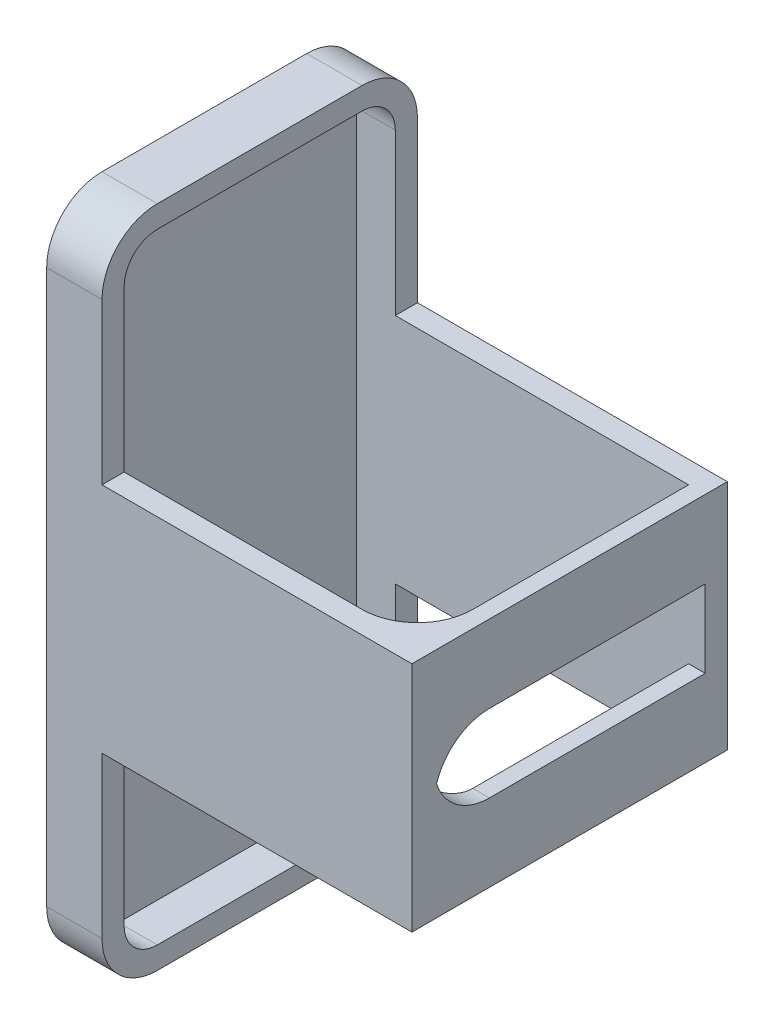
ISO-10303-21;
HEADER;
FILE_DESCRIPTION(('STEP AP214'),'2;1');
FILE_NAME('part.step','',(''),(''),'','','');
FILE_SCHEMA(('AUTOMOTIVE_DESIGN { 1 0 10303 214 1 1 1 1 }'));
ENDSEC;
DATA;
#1=APPLICATION_CONTEXT('core data for automotive mechanical design processes');
#2=APPLICATION_PROTOCOL_DEFINITION('international standard','automotive_design',2000,#1);
#3=PRODUCT_CONTEXT('',#1,'mechanical');
#4=PRODUCT('Part','Part','',(#3));
#5=PRODUCT_RELATED_PRODUCT_CATEGORY('part','',(#4));
#6=PRODUCT_DEFINITION_FORMATION('','',#4);
#7=PRODUCT_DEFINITION_CONTEXT('part definition',#1,'design');
#8=PRODUCT_DEFINITION('design','',#6,#7);
#9=PRODUCT_DEFINITION_SHAPE('','',#8);
#10=(LENGTH_UNIT() NAMED_UNIT(*) SI_UNIT(.MILLI.,.METRE.));
#11=(NAMED_UNIT(*) PLANE_ANGLE_UNIT() SI_UNIT($,.RADIAN.));
#12=(NAMED_UNIT(*) SI_UNIT($,.STERADIAN.) SOLID_ANGLE_UNIT());
#13=UNCERTAINTY_MEASURE_WITH_UNIT(LENGTH_MEASURE(1.E-05),#10,'distance_accuracy_value','');
#14=(GEOMETRIC_REPRESENTATION_CONTEXT(3) GLOBAL_UNCERTAINTY_ASSIGNED_CONTEXT((#13)) GLOBAL_UNIT_ASSIGNED_CONTEXT((#10,
#11,#12)) REPRESENTATION_CONTEXT('',''));
#15=CARTESIAN_POINT('',(0.,0.,0.));
#16=DIRECTION('',(0.,0.,1.));
#17=DIRECTION('',(1.,0.,0.));
#18=AXIS2_PLACEMENT_3D('',#15,#16,#17);
#19=CARTESIAN_POINT('',(157.5,-50.,-24.5));
#20=DIRECTION('',(0.,0.,1.));
#21=DIRECTION('',(0.,-1.,0.));
#22=AXIS2_PLACEMENT_3D('',#19,#20,#21);
#23=PLANE('',#22);
#24=DIRECTION('',(0.,1.,0.));
#25=VECTOR('',#24,1.);
#26=CARTESIAN_POINT('',(-94.5,-50.,-24.5));
#27=LINE('',#26,#25);
#28=CARTESIAN_POINT('',(-94.5,-21.,-24.5));
#29=VERTEX_POINT('',#28);
#30=CARTESIAN_POINT('',(-94.5,-6.99999999999999,-24.5));
#31=VERTEX_POINT('',#30);
#32=EDGE_CURVE('E472',#29,#31,#27,.T.);
#33=ORIENTED_EDGE('',*,*,#32,.T.);
#34=DIRECTION('',(1.,0.,0.));
#35=VECTOR('',#34,1.);
#36=CARTESIAN_POINT('',(157.5,-6.99999999999996,-24.5));
#37=LINE('',#36,#35);
#38=CARTESIAN_POINT('',(-91.5,-6.99999999999999,-24.5));
#39=VERTEX_POINT('',#38);
#40=EDGE_CURVE('E469',#31,#39,#37,.T.);
#41=ORIENTED_EDGE('',*,*,#40,.T.);
#42=DIRECTION('',(0.,1.,0.));
#43=VECTOR('',#42,1.);
#44=CARTESIAN_POINT('',(-91.5,0.,-24.5));
#45=LINE('',#44,#43);
#46=CARTESIAN_POINT('',(-91.5,7.00000000000001,-24.5));
#47=VERTEX_POINT('',#46);
#48=EDGE_CURVE('E466',#39,#47,#45,.T.);
#49=ORIENTED_EDGE('',*,*,#48,.T.);
#50=DIRECTION('',(1.,0.,0.));
#51=VECTOR('',#50,1.);
#52=CARTESIAN_POINT('',(157.5,7.00000000000004,-24.5));
#53=LINE('',#52,#51);
#54=CARTESIAN_POINT('',(-94.5,7.00000000000001,-24.5));
#55=VERTEX_POINT('',#54);
#56=EDGE_CURVE('E475',#55,#47,#53,.T.);
#57=ORIENTED_EDGE('',*,*,#56,.F.);
#58=DIRECTION('',(0.,1.,0.));
#59=VECTOR('',#58,1.);
#60=CARTESIAN_POINT('',(-94.5,-50.,-24.5));
#61=LINE('',#60,#59);
#62=CARTESIAN_POINT('',(-94.5,21.,-24.5));
#63=VERTEX_POINT('',#62);
#64=EDGE_CURVE('E478',#55,#63,#61,.T.);
#65=ORIENTED_EDGE('',*,*,#64,.T.);
#66=DIRECTION('',(1.,0.,0.));
#67=VECTOR('',#66,1.);
#68=CARTESIAN_POINT('',(157.5,21.,-24.5));
#69=LINE('',#68,#67);
#70=CARTESIAN_POINT('',(-147.5,21.,-24.5));
#71=VERTEX_POINT('',#70);
#72=EDGE_CURVE('E395',#71,#63,#69,.T.);
#73=ORIENTED_EDGE('',*,*,#72,.F.);
#74=DIRECTION('',(0.,1.,0.));
#75=VECTOR('',#74,1.);
#76=CARTESIAN_POINT('',(-147.5,-50.,-24.5));
#77=LINE('',#76,#75);
#78=CARTESIAN_POINT('',(-147.5,50.,-24.5));
#79=VERTEX_POINT('',#78);
#80=EDGE_CURVE('E381',#71,#79,#77,.T.);
#81=ORIENTED_EDGE('',*,*,#80,.T.);
#82=DIRECTION('',(-1.,0.,0.));
#83=VECTOR('',#82,1.);
#84=CARTESIAN_POINT('',(157.5,50.,-24.5));
#85=LINE('',#84,#83);
#86=CARTESIAN_POINT('',(-154.5,50.,-24.5));
#87=VERTEX_POINT('',#86);
#88=EDGE_CURVE('E360',#79,#87,#85,.T.);
#89=ORIENTED_EDGE('',*,*,#88,.T.);
#90=DIRECTION('',(0.,-1.,0.));
#91=VECTOR('',#90,1.);
#92=CARTESIAN_POINT('',(-154.5,-50.,-24.5));
#93=LINE('',#92,#91);
#94=CARTESIAN_POINT('',(-154.5,-50.,-24.5));
#95=VERTEX_POINT('',#94);
#96=EDGE_CURVE('E434',#87,#95,#93,.T.);
#97=ORIENTED_EDGE('',*,*,#96,.T.);
#98=DIRECTION('',(-1.,0.,0.));
#99=VECTOR('',#98,1.);
#100=CARTESIAN_POINT('',(157.5,-50.,-24.5));
#101=LINE('',#100,#99);
#102=CARTESIAN_POINT('',(-147.5,-50.,-24.5));
#103=VERTEX_POINT('',#102);
#104=EDGE_CURVE('E357',#103,#95,#101,.T.);
#105=ORIENTED_EDGE('',*,*,#104,.F.);
#106=DIRECTION('',(0.,-1.,0.));
#107=VECTOR('',#106,1.);
#108=CARTESIAN_POINT('',(-147.5,-50.,-24.5));
#109=LINE('',#108,#107);
#110=CARTESIAN_POINT('',(-147.5,-21.,-24.5));
#111=VERTEX_POINT('',#110);
#112=EDGE_CURVE('E407',#111,#103,#109,.T.);
#113=ORIENTED_EDGE('',*,*,#112,.F.);
#114=DIRECTION('',(-1.,0.,0.));
#115=VECTOR('',#114,1.);
#116=CARTESIAN_POINT('',(157.5,-21.,-24.5));
#117=LINE('',#116,#115);
#118=EDGE_CURVE('E417',#29,#111,#117,.T.);
#119=ORIENTED_EDGE('',*,*,#118,.F.);
#120=EDGE_LOOP('',(#33,#41,#49,#57,#65,#73,#81,#89,#97,#105,#113,#119));
#121=FACE_BOUND('',#120,.T.);
#122=ADVANCED_FACE('F43',(#121),#23,.T.);
#123=CARTESIAN_POINT('',(157.5,-50.,24.5));
#124=DIRECTION('',(0.,0.,-1.));
#125=DIRECTION('',(0.,1.,0.));
#126=AXIS2_PLACEMENT_3D('',#123,#124,#125);
#127=PLANE('',#126);
#128=DIRECTION('',(-1.,0.,0.));
#129=VECTOR('',#128,1.);
#130=CARTESIAN_POINT('',(157.5,21.,24.5));
#131=LINE('',#130,#129);
#132=CARTESIAN_POINT('',(-104.5,21.,24.5));
#133=VERTEX_POINT('',#132);
#134=CARTESIAN_POINT('',(-147.5,21.,24.5));
#135=VERTEX_POINT('',#134);
#136=EDGE_CURVE('E304',#133,#135,#131,.T.);
#137=ORIENTED_EDGE('',*,*,#136,.F.);
#138=DIRECTION('',(0.,1.,0.));
#139=VECTOR('',#138,1.);
#140=CARTESIAN_POINT('',(-104.5,-50.,24.5));
#141=LINE('',#140,#139);
#142=CARTESIAN_POINT('',(-104.5,3.,24.5));
#143=VERTEX_POINT('',#142);
#144=EDGE_CURVE('E283',#133,#143,#141,.F.);
#145=ORIENTED_EDGE('',*,*,#144,.T.);
#146=DIRECTION('',(0.,1.,0.));
#147=VECTOR('',#146,1.);
#148=CARTESIAN_POINT('',(-104.5,-50.,24.5));
#149=LINE('',#148,#147);
#150=CARTESIAN_POINT('',(-104.5,-2.99999999999999,24.5));
#151=VERTEX_POINT('',#150);
#152=EDGE_CURVE('E285',#143,#151,#149,.F.);
#153=ORIENTED_EDGE('',*,*,#152,.T.);
#154=DIRECTION('',(0.,1.,0.));
#155=VECTOR('',#154,1.);
#156=CARTESIAN_POINT('',(-104.5,-50.,24.5));
#157=LINE('',#156,#155);
#158=CARTESIAN_POINT('',(-104.5,-21.,24.5));
#159=VERTEX_POINT('',#158);
#160=EDGE_CURVE('E267',#151,#159,#157,.F.);
#161=ORIENTED_EDGE('',*,*,#160,.T.);
#162=DIRECTION('',(1.,0.,0.));
#163=VECTOR('',#162,1.);
#164=CARTESIAN_POINT('',(157.5,-21.,24.5));
#165=LINE('',#164,#163);
#166=CARTESIAN_POINT('',(-147.5,-21.,24.5));
#167=VERTEX_POINT('',#166);
#168=EDGE_CURVE('E308',#167,#159,#165,.T.);
#169=ORIENTED_EDGE('',*,*,#168,.F.);
#170=DIRECTION('',(0.,1.,0.));
#171=VECTOR('',#170,1.);
#172=CARTESIAN_POINT('',(-147.5,-50.,24.5));
#173=LINE('',#172,#171);
#174=CARTESIAN_POINT('',(-147.5,-50.,24.5));
#175=VERTEX_POINT('',#174);
#176=EDGE_CURVE('E306',#175,#167,#173,.T.);
#177=ORIENTED_EDGE('',*,*,#176,.F.);
#178=DIRECTION('',(-1.,0.,0.));
#179=VECTOR('',#178,1.);
#180=CARTESIAN_POINT('',(157.5,-50.,24.5));
#181=LINE('',#180,#179);
#182=CARTESIAN_POINT('',(-154.5,-50.,24.5));
#183=VERTEX_POINT('',#182);
#184=EDGE_CURVE('E372',#175,#183,#181,.T.);
#185=ORIENTED_EDGE('',*,*,#184,.T.);
#186=DIRECTION('',(0.,1.,0.));
#187=VECTOR('',#186,1.);
#188=CARTESIAN_POINT('',(-154.5,-50.,24.5));
#189=LINE('',#188,#187);
#190=CARTESIAN_POINT('',(-154.5,50.,24.5));
#191=VERTEX_POINT('',#190);
#192=EDGE_CURVE('E457',#183,#191,#189,.T.);
#193=ORIENTED_EDGE('',*,*,#192,.T.);
#194=DIRECTION('',(-1.,0.,0.));
#195=VECTOR('',#194,1.);
#196=CARTESIAN_POINT('',(157.5,50.,24.5));
#197=LINE('',#196,#195);
#198=CARTESIAN_POINT('',(-147.5,50.,24.5));
#199=VERTEX_POINT('',#198);
#200=EDGE_CURVE('E369',#199,#191,#197,.T.);
#201=ORIENTED_EDGE('',*,*,#200,.F.);
#202=DIRECTION('',(0.,-1.,0.));
#203=VECTOR('',#202,1.);
#204=CARTESIAN_POINT('',(-147.5,-50.,24.5));
#205=LINE('',#204,#203);
#206=EDGE_CURVE('E301',#199,#135,#205,.T.);
#207=ORIENTED_EDGE('',*,*,#206,.T.);
#208=EDGE_LOOP('',(#137,#145,#153,#161,#169,#177,#185,#193,#201,#207));
#209=FACE_BOUND('',#208,.T.);
#210=ADVANCED_FACE('F552',(#209),#127,.T.);
#211=CARTESIAN_POINT('',(-91.5,58.5,-15.));
#212=DIRECTION('',(-1.,0.,0.));
#213=DIRECTION('',(0.,-1.,0.));
#214=AXIS2_PLACEMENT_3D('',#211,#212,#213);
#215=PLANE('',#214);
#216=ORIENTED_EDGE('',*,*,#48,.F.);
#217=DIRECTION('',(0.,0.,-1.));
#218=VECTOR('',#217,1.);
#219=CARTESIAN_POINT('',(-91.5,-6.99999999999999,0.));
#220=LINE('',#219,#218);
#221=CARTESIAN_POINT('',(-91.5,-7.,14.5));
#222=VERTEX_POINT('',#221);
#223=EDGE_CURVE('E242',#222,#39,#220,.T.);
#224=ORIENTED_EDGE('',*,*,#223,.F.);
#225=CARTESIAN_POINT('',(-91.5,3.,14.5));
#226=DIRECTION('',(-1.,0.,0.));
#227=DIRECTION('',(0.,-1.,0.));
#228=AXIS2_PLACEMENT_3D('',#225,#226,#227);
#229=CIRCLE('',#228,10.);
#230=CARTESIAN_POINT('',(-91.5,0.,24.0393920141695));
#231=VERTEX_POINT('',#230);
#232=EDGE_CURVE('E61',#222,#231,#229,.T.);
#233=ORIENTED_EDGE('',*,*,#232,.T.);
#234=CARTESIAN_POINT('',(-91.5,-2.99999999999999,14.5));
#235=DIRECTION('',(-1.,0.,0.));
#236=DIRECTION('',(0.,-1.,0.));
#237=AXIS2_PLACEMENT_3D('',#234,#235,#236);
#238=CIRCLE('',#237,10.);
#239=CARTESIAN_POINT('',(-91.5,7.00000000000001,14.5));
#240=VERTEX_POINT('',#239);
#241=EDGE_CURVE('E271',#231,#240,#238,.T.);
#242=ORIENTED_EDGE('',*,*,#241,.T.);
#243=DIRECTION('',(0.,0.,-1.));
#244=VECTOR('',#243,1.);
#245=CARTESIAN_POINT('',(-91.5,7.00000000000001,0.));
#246=LINE('',#245,#244);
#247=EDGE_CURVE('E258',#240,#47,#246,.T.);
#248=ORIENTED_EDGE('',*,*,#247,.T.);
#249=EDGE_LOOP('',(#216,#224,#233,#242,#248));
#250=FACE_BOUND('',#249,.T.);
#251=DIRECTION('',(0.,1.,0.));
#252=VECTOR('',#251,1.);
#253=CARTESIAN_POINT('',(-91.5,-50.,28.5));
#254=LINE('',#253,#252);
#255=CARTESIAN_POINT('',(-91.5,-21.,28.5));
#256=VERTEX_POINT('',#255);
#257=CARTESIAN_POINT('',(-91.5,21.,28.5));
#258=VERTEX_POINT('',#257);
#259=EDGE_CURVE('E293',#256,#258,#254,.T.);
#260=ORIENTED_EDGE('',*,*,#259,.F.);
#261=DIRECTION('',(0.,0.,1.));
#262=VECTOR('',#261,1.);
#263=CARTESIAN_POINT('',(-91.5,-21.,-28.500012));
#264=LINE('',#263,#262);
#265=CARTESIAN_POINT('',(-91.5,-21.,-28.5));
#266=VERTEX_POINT('',#265);
#267=EDGE_CURVE('E440',#266,#256,#264,.T.);
#268=ORIENTED_EDGE('',*,*,#267,.F.);
#269=DIRECTION('',(0.,-1.,0.));
#270=VECTOR('',#269,1.);
#271=CARTESIAN_POINT('',(-91.5,-50.,-28.5));
#272=LINE('',#271,#270);
#273=CARTESIAN_POINT('',(-91.5,21.,-28.5));
#274=VERTEX_POINT('',#273);
#275=EDGE_CURVE('E296',#274,#266,#272,.T.);
#276=ORIENTED_EDGE('',*,*,#275,.F.);
#277=DIRECTION('',(0.,0.,1.));
#278=VECTOR('',#277,1.);
#279=CARTESIAN_POINT('',(-91.5,21.,-28.500012));
#280=LINE('',#279,#278);
#281=EDGE_CURVE('E292',#274,#258,#280,.T.);
#282=ORIENTED_EDGE('',*,*,#281,.T.);
#283=EDGE_LOOP('',(#260,#268,#276,#282));
#284=FACE_BOUND('',#283,.T.);
#285=ADVANCED_FACE('F601',(#250,#284),#215,.F.);
#286=CARTESIAN_POINT('',(157.5,-60.,-18.5));
#287=DIRECTION('',(0.,1.,0.));
#288=DIRECTION('',(0.,0.,1.));
#289=AXIS2_PLACEMENT_3D('',#286,#287,#288);
#290=PLANE('',#289);
#291=DIRECTION('',(0.,0.,-1.));
#292=VECTOR('',#291,1.);
#293=CARTESIAN_POINT('',(-157.5,-60.,-18.5));
#294=LINE('',#293,#292);
#295=CARTESIAN_POINT('',(-157.5,-60.,18.5));
#296=VERTEX_POINT('',#295);
#297=CARTESIAN_POINT('',(-157.5,-60.,-18.5));
#298=VERTEX_POINT('',#297);
#299=EDGE_CURVE('E327',#296,#298,#294,.T.);
#300=ORIENTED_EDGE('',*,*,#299,.T.);
#301=DIRECTION('',(-1.,0.,0.));
#302=VECTOR('',#301,1.);
#303=CARTESIAN_POINT('',(157.5,-60.,-18.5));
#304=LINE('',#303,#302);
#305=CARTESIAN_POINT('',(-147.5,-60.,-18.5));
#306=VERTEX_POINT('',#305);
#307=EDGE_CURVE('E325',#306,#298,#304,.T.);
#308=ORIENTED_EDGE('',*,*,#307,.F.);
#309=DIRECTION('',(0.,0.,1.));
#310=VECTOR('',#309,1.);
#311=CARTESIAN_POINT('',(-147.5,-60.,-28.500012));
#312=LINE('',#311,#310);
#313=CARTESIAN_POINT('',(-147.5,-60.,18.4999999999999));
#314=VERTEX_POINT('',#313);
#315=EDGE_CURVE('E419',#306,#314,#312,.T.);
#316=ORIENTED_EDGE('',*,*,#315,.T.);
#317=DIRECTION('',(-1.,0.,0.));
#318=VECTOR('',#317,1.);
#319=CARTESIAN_POINT('',(157.5,-60.,18.5));
#320=LINE('',#319,#318);
#321=EDGE_CURVE('E323',#314,#296,#320,.T.);
#322=ORIENTED_EDGE('',*,*,#321,.T.);
#323=EDGE_LOOP('',(#300,#308,#316,#322));
#324=FACE_BOUND('',#323,.T.);
#325=ADVANCED_FACE('F594',(#324),#290,.F.);
#326=CARTESIAN_POINT('',(157.5,-56.,-18.5));
#327=DIRECTION('',(0.,1.,0.));
#328=DIRECTION('',(0.,0.,1.));
#329=AXIS2_PLACEMENT_3D('',#326,#327,#328);
#330=PLANE('',#329);
#331=DIRECTION('',(-1.,0.,0.));
#332=VECTOR('',#331,1.);
#333=CARTESIAN_POINT('',(157.5,-56.,-18.5));
#334=LINE('',#333,#332);
#335=CARTESIAN_POINT('',(-147.5,-56.,-18.5));
#336=VERTEX_POINT('',#335);
#337=CARTESIAN_POINT('',(-154.5,-56.,-18.5));
#338=VERTEX_POINT('',#337);
#339=EDGE_CURVE('E354',#336,#338,#334,.T.);
#340=ORIENTED_EDGE('',*,*,#339,.T.);
#341=DIRECTION('',(0.,0.,1.));
#342=VECTOR('',#341,1.);
#343=CARTESIAN_POINT('',(-154.5,-56.,-18.5));
#344=LINE('',#343,#342);
#345=CARTESIAN_POINT('',(-154.5,-56.,18.5));
#346=VERTEX_POINT('',#345);
#347=EDGE_CURVE('E463',#338,#346,#344,.T.);
#348=ORIENTED_EDGE('',*,*,#347,.T.);
#349=DIRECTION('',(-1.,0.,0.));
#350=VECTOR('',#349,1.);
#351=CARTESIAN_POINT('',(157.5,-56.,18.5));
#352=LINE('',#351,#350);
#353=CARTESIAN_POINT('',(-147.5,-56.,18.5));
#354=VERTEX_POINT('',#353);
#355=EDGE_CURVE('E351',#354,#346,#352,.T.);
#356=ORIENTED_EDGE('',*,*,#355,.F.);
#357=DIRECTION('',(0.,0.,1.));
#358=VECTOR('',#357,1.);
#359=CARTESIAN_POINT('',(-147.5,-56.,-18.5));
#360=LINE('',#359,#358);
#361=EDGE_CURVE('E411',#336,#354,#360,.T.);
#362=ORIENTED_EDGE('',*,*,#361,.F.);
#363=EDGE_LOOP('',(#340,#348,#356,#362));
#364=FACE_BOUND('',#363,.T.);
#365=ADVANCED_FACE('F575',(#364),#330,.T.);
#366=CARTESIAN_POINT('',(157.5,56.,-18.5));
#367=DIRECTION('',(0.,-1.,0.));
#368=DIRECTION('',(0.,0.,-1.));
#369=AXIS2_PLACEMENT_3D('',#366,#367,#368);
#370=PLANE('',#369);
#371=DIRECTION('',(-1.,0.,0.));
#372=VECTOR('',#371,1.);
#373=CARTESIAN_POINT('',(157.5,56.,18.5));
#374=LINE('',#373,#372);
#375=CARTESIAN_POINT('',(-147.5,56.,18.5));
#376=VERTEX_POINT('',#375);
#377=CARTESIAN_POINT('',(-154.5,56.,18.5));
#378=VERTEX_POINT('',#377);
#379=EDGE_CURVE('E366',#376,#378,#374,.T.);
#380=ORIENTED_EDGE('',*,*,#379,.T.);
#381=DIRECTION('',(0.,0.,-1.));
#382=VECTOR('',#381,1.);
#383=CARTESIAN_POINT('',(-154.5,56.,-18.5));
#384=LINE('',#383,#382);
#385=CARTESIAN_POINT('',(-154.5,56.,-18.5));
#386=VERTEX_POINT('',#385);
#387=EDGE_CURVE('E451',#378,#386,#384,.T.);
#388=ORIENTED_EDGE('',*,*,#387,.T.);
#389=DIRECTION('',(-1.,0.,0.));
#390=VECTOR('',#389,1.);
#391=CARTESIAN_POINT('',(157.5,56.,-18.5));
#392=LINE('',#391,#390);
#393=CARTESIAN_POINT('',(-147.5,56.,-18.5));
#394=VERTEX_POINT('',#393);
#395=EDGE_CURVE('E363',#394,#386,#392,.T.);
#396=ORIENTED_EDGE('',*,*,#395,.F.);
#397=DIRECTION('',(0.,0.,1.));
#398=VECTOR('',#397,1.);
#399=CARTESIAN_POINT('',(-147.5,56.,-18.5));
#400=LINE('',#399,#398);
#401=EDGE_CURVE('E387',#394,#376,#400,.T.);
#402=ORIENTED_EDGE('',*,*,#401,.T.);
#403=EDGE_LOOP('',(#380,#388,#396,#402));
#404=FACE_BOUND('',#403,.T.);
#405=ADVANCED_FACE('F559',(#404),#370,.T.);
#406=CARTESIAN_POINT('',(157.5,60.,-18.5));
#407=DIRECTION('',(0.,-1.,0.));
#408=DIRECTION('',(0.,0.,-1.));
#409=AXIS2_PLACEMENT_3D('',#406,#407,#408);
#410=PLANE('',#409);
#411=DIRECTION('',(0.,0.,1.));
#412=VECTOR('',#411,1.);
#413=CARTESIAN_POINT('',(-157.5,60.,-18.5));
#414=LINE('',#413,#412);
#415=CARTESIAN_POINT('',(-157.5,60.,-18.5));
#416=VERTEX_POINT('',#415);
#417=CARTESIAN_POINT('',(-157.5,60.,18.5));
#418=VERTEX_POINT('',#417);
#419=EDGE_CURVE('E339',#416,#418,#414,.T.);
#420=ORIENTED_EDGE('',*,*,#419,.T.);
#421=DIRECTION('',(-1.,0.,0.));
#422=VECTOR('',#421,1.);
#423=CARTESIAN_POINT('',(157.5,60.,18.5));
#424=LINE('',#423,#422);
#425=CARTESIAN_POINT('',(-147.5,60.,18.5));
#426=VERTEX_POINT('',#425);
#427=EDGE_CURVE('E317',#426,#418,#424,.T.);
#428=ORIENTED_EDGE('',*,*,#427,.F.);
#429=DIRECTION('',(0.,0.,1.));
#430=VECTOR('',#429,1.);
#431=CARTESIAN_POINT('',(-147.5,60.,-28.500012));
#432=LINE('',#431,#430);
#433=CARTESIAN_POINT('',(-147.5,60.,-18.5));
#434=VERTEX_POINT('',#433);
#435=EDGE_CURVE('E420',#434,#426,#432,.T.);
#436=ORIENTED_EDGE('',*,*,#435,.F.);
#437=DIRECTION('',(-1.,0.,0.));
#438=VECTOR('',#437,1.);
#439=CARTESIAN_POINT('',(157.5,60.,-18.5));
#440=LINE('',#439,#438);
#441=EDGE_CURVE('E315',#434,#416,#440,.T.);
#442=ORIENTED_EDGE('',*,*,#441,.T.);
#443=EDGE_LOOP('',(#420,#428,#436,#442));
#444=FACE_BOUND('',#443,.T.);
#445=ADVANCED_FACE('F537',(#444),#410,.F.);
#446=CARTESIAN_POINT('',(157.5,-50.,18.5));
#447=DIRECTION('',(-1.,0.,0.));
#448=DIRECTION('',(0.,0.,1.));
#449=AXIS2_PLACEMENT_3D('',#446,#447,#448);
#450=CYLINDRICAL_SURFACE('',#449,10.);
#451=CARTESIAN_POINT('',(-157.5,-50.,18.5));
#452=DIRECTION('',(1.,0.,0.));
#453=DIRECTION('',(0.,0.,1.));
#454=AXIS2_PLACEMENT_3D('',#451,#452,#453);
#455=CIRCLE('',#454,10.);
#456=CARTESIAN_POINT('',(-157.5,-50.,28.5));
#457=VERTEX_POINT('',#456);
#458=EDGE_CURVE('E330',#457,#296,#455,.T.);
#459=ORIENTED_EDGE('',*,*,#458,.T.);
#460=ORIENTED_EDGE('',*,*,#321,.F.);
#461=CARTESIAN_POINT('',(-147.5,-50.,18.5));
#462=DIRECTION('',(-1.,0.,0.));
#463=DIRECTION('',(0.,0.,1.));
#464=AXIS2_PLACEMENT_3D('',#461,#462,#463);
#465=CIRCLE('',#464,10.);
#466=CARTESIAN_POINT('',(-147.5,-50.,28.5));
#467=VERTEX_POINT('',#466);
#468=EDGE_CURVE('E404',#314,#467,#465,.T.);
#469=ORIENTED_EDGE('',*,*,#468,.T.);
#470=DIRECTION('',(-1.,0.,0.));
#471=VECTOR('',#470,1.);
#472=CARTESIAN_POINT('',(157.5,-50.,28.5));
#473=LINE('',#472,#471);
#474=EDGE_CURVE('E321',#467,#457,#473,.T.);
#475=ORIENTED_EDGE('',*,*,#474,.T.);
#476=EDGE_LOOP('',(#459,#460,#469,#475));
#477=FACE_BOUND('',#476,.T.);
#478=ADVANCED_FACE('F586',(#477),#450,.T.);
#479=CARTESIAN_POINT('',(157.5,50.,18.5));
#480=DIRECTION('',(-1.,0.,0.));
#481=DIRECTION('',(0.,0.,1.));
#482=AXIS2_PLACEMENT_3D('',#479,#480,#481);
#483=CYLINDRICAL_SURFACE('',#482,10.);
#484=CARTESIAN_POINT('',(-157.5,50.,18.5));
#485=DIRECTION('',(1.,0.,0.));
#486=DIRECTION('',(0.,0.,1.));
#487=AXIS2_PLACEMENT_3D('',#484,#485,#486);
#488=CIRCLE('',#487,10.);
#489=CARTESIAN_POINT('',(-157.5,50.,28.5));
#490=VERTEX_POINT('',#489);
#491=EDGE_CURVE('E336',#418,#490,#488,.T.);
#492=ORIENTED_EDGE('',*,*,#491,.T.);
#493=DIRECTION('',(-1.,0.,0.));
#494=VECTOR('',#493,1.);
#495=CARTESIAN_POINT('',(157.5,50.,28.5));
#496=LINE('',#495,#494);
#497=CARTESIAN_POINT('',(-147.5,50.,28.5));
#498=VERTEX_POINT('',#497);
#499=EDGE_CURVE('E319',#498,#490,#496,.T.);
#500=ORIENTED_EDGE('',*,*,#499,.F.);
#501=CARTESIAN_POINT('',(-147.5,50.,18.5));
#502=DIRECTION('',(1.,0.,0.));
#503=DIRECTION('',(0.,0.,-1.));
#504=AXIS2_PLACEMENT_3D('',#501,#502,#503);
#505=CIRCLE('',#504,10.);
#506=EDGE_CURVE('E379',#426,#498,#505,.T.);
#507=ORIENTED_EDGE('',*,*,#506,.F.);
#508=ORIENTED_EDGE('',*,*,#427,.T.);
#509=EDGE_LOOP('',(#492,#500,#507,#508));
#510=FACE_BOUND('',#509,.T.);
#511=ADVANCED_FACE('F540',(#510),#483,.T.);
#512=CARTESIAN_POINT('',(157.5,50.,-18.5));
#513=DIRECTION('',(-1.,0.,0.));
#514=DIRECTION('',(0.,0.,1.));
#515=AXIS2_PLACEMENT_3D('',#512,#513,#514);
#516=CYLINDRICAL_SURFACE('',#515,10.);
#517=CARTESIAN_POINT('',(-157.5,50.,-18.5));
#518=DIRECTION('',(1.,0.,0.));
#519=DIRECTION('',(0.,0.,-1.));
#520=AXIS2_PLACEMENT_3D('',#517,#518,#519);
#521=CIRCLE('',#520,10.);
#522=CARTESIAN_POINT('',(-157.5,50.,-28.5));
#523=VERTEX_POINT('',#522);
#524=EDGE_CURVE('E342',#523,#416,#521,.T.);
#525=ORIENTED_EDGE('',*,*,#524,.T.);
#526=ORIENTED_EDGE('',*,*,#441,.F.);
#527=CARTESIAN_POINT('',(-147.5,50.,-18.5));
#528=DIRECTION('',(1.,0.,0.));
#529=DIRECTION('',(0.,0.,-1.));
#530=AXIS2_PLACEMENT_3D('',#527,#528,#529);
#531=CIRCLE('',#530,10.);
#532=CARTESIAN_POINT('',(-147.5,50.,-28.5));
#533=VERTEX_POINT('',#532);
#534=EDGE_CURVE('E377',#533,#434,#531,.T.);
#535=ORIENTED_EDGE('',*,*,#534,.F.);
#536=DIRECTION('',(-1.,0.,0.));
#537=VECTOR('',#536,1.);
#538=CARTESIAN_POINT('',(157.5,50.,-28.5));
#539=LINE('',#538,#537);
#540=EDGE_CURVE('E313',#533,#523,#539,.T.);
#541=ORIENTED_EDGE('',*,*,#540,.T.);
#542=EDGE_LOOP('',(#525,#526,#535,#541));
#543=FACE_BOUND('',#542,.T.);
#544=ADVANCED_FACE('F530',(#543),#516,.T.);
#545=CARTESIAN_POINT('',(-157.5,-50.,-18.5));
#546=DIRECTION('',(-1.,0.,0.));
#547=DIRECTION('',(0.,0.,1.));
#548=AXIS2_PLACEMENT_3D('',#545,#546,#547);
#549=PLANE('',#548);
#550=CARTESIAN_POINT('',(-157.5,-50.,-18.5));
#551=DIRECTION('',(1.,0.,0.));
#552=DIRECTION('',(0.,0.,1.));
#553=AXIS2_PLACEMENT_3D('',#550,#551,#552);
#554=CIRCLE('',#553,10.);
#555=CARTESIAN_POINT('',(-157.5,-50.,-28.5));
#556=VERTEX_POINT('',#555);
#557=EDGE_CURVE('E348',#298,#556,#554,.T.);
#558=ORIENTED_EDGE('',*,*,#557,.F.);
#559=ORIENTED_EDGE('',*,*,#299,.F.);
#560=ORIENTED_EDGE('',*,*,#458,.F.);
#561=DIRECTION('',(0.,-1.,0.));
#562=VECTOR('',#561,1.);
#563=CARTESIAN_POINT('',(-157.5,-50.,28.5));
#564=LINE('',#563,#562);
#565=EDGE_CURVE('E333',#490,#457,#564,.T.);
#566=ORIENTED_EDGE('',*,*,#565,.F.);
#567=ORIENTED_EDGE('',*,*,#491,.F.);
#568=ORIENTED_EDGE('',*,*,#419,.F.);
#569=ORIENTED_EDGE('',*,*,#524,.F.);
#570=DIRECTION('',(0.,1.,0.));
#571=VECTOR('',#570,1.);
#572=CARTESIAN_POINT('',(-157.5,-50.,-28.5));
#573=LINE('',#572,#571);
#574=EDGE_CURVE('E345',#556,#523,#573,.T.);
#575=ORIENTED_EDGE('',*,*,#574,.F.);
#576=EDGE_LOOP('',(#558,#559,#560,#566,#567,#568,#569,#575));
#577=FACE_BOUND('',#576,.T.);
#578=ADVANCED_FACE('F591',(#577),#549,.T.);
#579=CARTESIAN_POINT('',(157.5,-50.,-18.5));
#580=DIRECTION('',(-1.,0.,0.));
#581=DIRECTION('',(0.,0.,1.));
#582=AXIS2_PLACEMENT_3D('',#579,#580,#581);
#583=CYLINDRICAL_SURFACE('',#582,10.);
#584=ORIENTED_EDGE('',*,*,#557,.T.);
#585=DIRECTION('',(-1.,0.,0.));
#586=VECTOR('',#585,1.);
#587=CARTESIAN_POINT('',(157.5,-50.,-28.5));
#588=LINE('',#587,#586);
#589=CARTESIAN_POINT('',(-147.5,-50.,-28.5));
#590=VERTEX_POINT('',#589);
#591=EDGE_CURVE('E311',#590,#556,#588,.T.);
#592=ORIENTED_EDGE('',*,*,#591,.F.);
#593=CARTESIAN_POINT('',(-147.5,-50.,-18.5));
#594=DIRECTION('',(-1.,0.,0.));
#595=DIRECTION('',(0.,0.,1.));
#596=AXIS2_PLACEMENT_3D('',#593,#594,#595);
#597=CIRCLE('',#596,10.);
#598=EDGE_CURVE('E398',#590,#306,#597,.T.);
#599=ORIENTED_EDGE('',*,*,#598,.T.);
#600=ORIENTED_EDGE('',*,*,#307,.T.);
#601=EDGE_LOOP('',(#584,#592,#599,#600));
#602=FACE_BOUND('',#601,.T.);
#603=ADVANCED_FACE('F597',(#602),#583,.T.);
#604=CARTESIAN_POINT('',(157.5,-21.,-28.500012));
#605=DIRECTION('',(0.,1.,0.));
#606=DIRECTION('',(-1.,0.,0.));
#607=AXIS2_PLACEMENT_3D('',#604,#605,#606);
#608=PLANE('',#607);
#609=ORIENTED_EDGE('',*,*,#267,.T.);
#610=DIRECTION('',(-1.,0.,0.));
#611=VECTOR('',#610,1.);
#612=CARTESIAN_POINT('',(157.5,-21.,28.5));
#613=LINE('',#612,#611);
#614=CARTESIAN_POINT('',(-147.5,-21.,28.5));
#615=VERTEX_POINT('',#614);
#616=EDGE_CURVE('E442',#256,#615,#613,.T.);
#617=ORIENTED_EDGE('',*,*,#616,.T.);
#618=DIRECTION('',(0.,0.,1.));
#619=VECTOR('',#618,1.);
#620=CARTESIAN_POINT('',(-147.5,-21.,-28.500012));
#621=LINE('',#620,#619);
#622=EDGE_CURVE('E438',#167,#615,#621,.T.);
#623=ORIENTED_EDGE('',*,*,#622,.F.);
#624=ORIENTED_EDGE('',*,*,#168,.T.);
#625=CARTESIAN_POINT('',(-104.5,-21.,14.5));
#626=DIRECTION('',(0.,1.,0.));
#627=DIRECTION('',(-1.,0.,0.));
#628=AXIS2_PLACEMENT_3D('',#625,#626,#627);
#629=CIRCLE('',#628,10.);
#630=CARTESIAN_POINT('',(-94.5,-21.,14.5));
#631=VERTEX_POINT('',#630);
#632=EDGE_CURVE('E12',#159,#631,#629,.T.);
#633=ORIENTED_EDGE('',*,*,#632,.T.);
#634=DIRECTION('',(0.,0.,-1.));
#635=VECTOR('',#634,1.);
#636=CARTESIAN_POINT('',(-94.5,-21.,0.));
#637=LINE('',#636,#635);
#638=EDGE_CURVE('E488',#631,#29,#637,.T.);
#639=ORIENTED_EDGE('',*,*,#638,.T.);
#640=ORIENTED_EDGE('',*,*,#118,.T.);
#641=CARTESIAN_POINT('',(-147.5,-21.,-28.5));
#642=VERTEX_POINT('',#641);
#643=EDGE_CURVE('E437',#642,#111,#621,.T.);
#644=ORIENTED_EDGE('',*,*,#643,.F.);
#645=DIRECTION('',(-1.,0.,0.));
#646=VECTOR('',#645,1.);
#647=CARTESIAN_POINT('',(157.5,-21.,-28.5));
#648=LINE('',#647,#646);
#649=EDGE_CURVE('E415',#266,#642,#648,.T.);
#650=ORIENTED_EDGE('',*,*,#649,.F.);
#651=EDGE_LOOP('',(#609,#617,#623,#624,#633,#639,#640,#644,#650));
#652=FACE_BOUND('',#651,.T.);
#653=ADVANCED_FACE('F493',(#652),#608,.F.);
#654=CARTESIAN_POINT('',(157.5,-50.,-18.5));
#655=DIRECTION('',(-1.,0.,0.));
#656=DIRECTION('',(0.,0.,1.));
#657=AXIS2_PLACEMENT_3D('',#654,#655,#656);
#658=CYLINDRICAL_SURFACE('',#657,6.);
#659=ORIENTED_EDGE('',*,*,#104,.T.);
#660=CARTESIAN_POINT('',(-154.5,-50.,-18.5));
#661=DIRECTION('',(-1.,0.,0.));
#662=DIRECTION('',(0.,0.,1.));
#663=AXIS2_PLACEMENT_3D('',#660,#661,#662);
#664=CIRCLE('',#663,6.);
#665=EDGE_CURVE('E298',#95,#338,#664,.T.);
#666=ORIENTED_EDGE('',*,*,#665,.T.);
#667=ORIENTED_EDGE('',*,*,#339,.F.);
#668=CARTESIAN_POINT('',(-147.5,-50.,-18.5));
#669=DIRECTION('',(-1.,0.,0.));
#670=DIRECTION('',(0.,0.,1.));
#671=AXIS2_PLACEMENT_3D('',#668,#669,#670);
#672=CIRCLE('',#671,6.);
#673=EDGE_CURVE('E409',#103,#336,#672,.T.);
#674=ORIENTED_EDGE('',*,*,#673,.F.);
#675=EDGE_LOOP('',(#659,#666,#667,#674));
#676=FACE_BOUND('',#675,.T.);
#677=ADVANCED_FACE('F566',(#676),#658,.F.);
#678=CARTESIAN_POINT('',(157.5,50.,-18.5));
#679=DIRECTION('',(-1.,0.,0.));
#680=DIRECTION('',(0.,0.,1.));
#681=AXIS2_PLACEMENT_3D('',#678,#679,#680);
#682=CYLINDRICAL_SURFACE('',#681,6.);
#683=ORIENTED_EDGE('',*,*,#395,.T.);
#684=CARTESIAN_POINT('',(-154.5,50.,-18.5));
#685=DIRECTION('',(-1.,0.,0.));
#686=DIRECTION('',(0.,0.,1.));
#687=AXIS2_PLACEMENT_3D('',#684,#685,#686);
#688=CIRCLE('',#687,6.);
#689=EDGE_CURVE('E448',#386,#87,#688,.T.);
#690=ORIENTED_EDGE('',*,*,#689,.T.);
#691=ORIENTED_EDGE('',*,*,#88,.F.);
#692=CARTESIAN_POINT('',(-147.5,50.,-18.5));
#693=DIRECTION('',(1.,0.,0.));
#694=DIRECTION('',(0.,0.,-1.));
#695=AXIS2_PLACEMENT_3D('',#692,#693,#694);
#696=CIRCLE('',#695,6.);
#697=EDGE_CURVE('E384',#79,#394,#696,.T.);
#698=ORIENTED_EDGE('',*,*,#697,.T.);
#699=EDGE_LOOP('',(#683,#690,#691,#698));
#700=FACE_BOUND('',#699,.T.);
#701=ADVANCED_FACE('F561',(#700),#682,.F.);
#702=CARTESIAN_POINT('',(157.5,50.,18.5));
#703=DIRECTION('',(-1.,0.,0.));
#704=DIRECTION('',(0.,0.,1.));
#705=AXIS2_PLACEMENT_3D('',#702,#703,#704);
#706=CYLINDRICAL_SURFACE('',#705,6.00000000000001);
#707=ORIENTED_EDGE('',*,*,#200,.T.);
#708=CARTESIAN_POINT('',(-154.5,50.,18.5));
#709=DIRECTION('',(-1.,0.,0.));
#710=DIRECTION('',(0.,0.,1.));
#711=AXIS2_PLACEMENT_3D('',#708,#709,#710);
#712=CIRCLE('',#711,6.00000000000001);
#713=EDGE_CURVE('E454',#191,#378,#712,.T.);
#714=ORIENTED_EDGE('',*,*,#713,.T.);
#715=ORIENTED_EDGE('',*,*,#379,.F.);
#716=CARTESIAN_POINT('',(-147.5,50.,18.5));
#717=DIRECTION('',(1.,0.,0.));
#718=DIRECTION('',(0.,0.,-1.));
#719=AXIS2_PLACEMENT_3D('',#716,#717,#718);
#720=CIRCLE('',#719,6.00000000000001);
#721=EDGE_CURVE('E390',#376,#199,#720,.T.);
#722=ORIENTED_EDGE('',*,*,#721,.T.);
#723=EDGE_LOOP('',(#707,#714,#715,#722));
#724=FACE_BOUND('',#723,.T.);
#725=ADVANCED_FACE('F555',(#724),#706,.F.);
#726=CARTESIAN_POINT('',(-154.5,-50.,-18.5));
#727=DIRECTION('',(-1.,0.,0.));
#728=DIRECTION('',(0.,0.,1.));
#729=AXIS2_PLACEMENT_3D('',#726,#727,#728);
#730=PLANE('',#729);
#731=ORIENTED_EDGE('',*,*,#96,.F.);
#732=ORIENTED_EDGE('',*,*,#689,.F.);
#733=ORIENTED_EDGE('',*,*,#387,.F.);
#734=ORIENTED_EDGE('',*,*,#713,.F.);
#735=ORIENTED_EDGE('',*,*,#192,.F.);
#736=CARTESIAN_POINT('',(-154.5,-50.,18.5));
#737=DIRECTION('',(-1.,0.,0.));
#738=DIRECTION('',(0.,0.,1.));
#739=AXIS2_PLACEMENT_3D('',#736,#737,#738);
#740=CIRCLE('',#739,6.);
#741=EDGE_CURVE('E460',#346,#183,#740,.T.);
#742=ORIENTED_EDGE('',*,*,#741,.F.);
#743=ORIENTED_EDGE('',*,*,#347,.F.);
#744=ORIENTED_EDGE('',*,*,#665,.F.);
#745=EDGE_LOOP('',(#731,#732,#733,#734,#735,#742,#743,#744));
#746=FACE_BOUND('',#745,.T.);
#747=ADVANCED_FACE('F630',(#746),#730,.F.);
#748=CARTESIAN_POINT('',(157.5,-50.,18.5));
#749=DIRECTION('',(-1.,0.,0.));
#750=DIRECTION('',(0.,0.,1.));
#751=AXIS2_PLACEMENT_3D('',#748,#749,#750);
#752=CYLINDRICAL_SURFACE('',#751,6.);
#753=ORIENTED_EDGE('',*,*,#355,.T.);
#754=ORIENTED_EDGE('',*,*,#741,.T.);
#755=ORIENTED_EDGE('',*,*,#184,.F.);
#756=CARTESIAN_POINT('',(-147.5,-50.,18.5));
#757=DIRECTION('',(-1.,0.,0.));
#758=DIRECTION('',(0.,0.,1.));
#759=AXIS2_PLACEMENT_3D('',#756,#757,#758);
#760=CIRCLE('',#759,6.);
#761=EDGE_CURVE('E413',#354,#175,#760,.T.);
#762=ORIENTED_EDGE('',*,*,#761,.F.);
#763=EDGE_LOOP('',(#753,#754,#755,#762));
#764=FACE_BOUND('',#763,.T.);
#765=ADVANCED_FACE('F577',(#764),#752,.F.);
#766=CARTESIAN_POINT('',(-147.5,-50.,-28.500012));
#767=DIRECTION('',(-1.,0.,0.));
#768=DIRECTION('',(0.,0.,1.));
#769=AXIS2_PLACEMENT_3D('',#766,#767,#768);
#770=PLANE('',#769);
#771=DIRECTION('',(0.,-1.,0.));
#772=VECTOR('',#771,1.);
#773=CARTESIAN_POINT('',(-147.5,-50.,-28.5));
#774=LINE('',#773,#772);
#775=EDGE_CURVE('E401',#642,#590,#774,.T.);
#776=ORIENTED_EDGE('',*,*,#775,.F.);
#777=ORIENTED_EDGE('',*,*,#643,.T.);
#778=ORIENTED_EDGE('',*,*,#112,.T.);
#779=ORIENTED_EDGE('',*,*,#673,.T.);
#780=ORIENTED_EDGE('',*,*,#361,.T.);
#781=ORIENTED_EDGE('',*,*,#761,.T.);
#782=ORIENTED_EDGE('',*,*,#176,.T.);
#783=ORIENTED_EDGE('',*,*,#622,.T.);
#784=DIRECTION('',(0.,-1.,0.));
#785=VECTOR('',#784,1.);
#786=CARTESIAN_POINT('',(-147.5,-50.,28.5));
#787=LINE('',#786,#785);
#788=EDGE_CURVE('E422',#615,#467,#787,.T.);
#789=ORIENTED_EDGE('',*,*,#788,.T.);
#790=ORIENTED_EDGE('',*,*,#468,.F.);
#791=ORIENTED_EDGE('',*,*,#315,.F.);
#792=ORIENTED_EDGE('',*,*,#598,.F.);
#793=EDGE_LOOP('',(#776,#777,#778,#779,#780,#781,#782,#783,#789,#790,#791,#792));
#794=FACE_BOUND('',#793,.T.);
#795=ADVANCED_FACE('F571',(#794),#770,.F.);
#796=CARTESIAN_POINT('',(157.5,-50.,-28.5));
#797=DIRECTION('',(0.,0.,1.));
#798=DIRECTION('',(0.,-1.,0.));
#799=AXIS2_PLACEMENT_3D('',#796,#797,#798);
#800=PLANE('',#799);
#801=ORIENTED_EDGE('',*,*,#275,.T.);
#802=ORIENTED_EDGE('',*,*,#649,.T.);
#803=ORIENTED_EDGE('',*,*,#775,.T.);
#804=ORIENTED_EDGE('',*,*,#591,.T.);
#805=ORIENTED_EDGE('',*,*,#574,.T.);
#806=ORIENTED_EDGE('',*,*,#540,.F.);
#807=DIRECTION('',(0.,1.,0.));
#808=VECTOR('',#807,1.);
#809=CARTESIAN_POINT('',(-147.5,-50.,-28.5));
#810=LINE('',#809,#808);
#811=CARTESIAN_POINT('',(-147.5,21.,-28.5));
#812=VERTEX_POINT('',#811);
#813=EDGE_CURVE('E375',#812,#533,#810,.T.);
#814=ORIENTED_EDGE('',*,*,#813,.F.);
#815=DIRECTION('',(1.,0.,0.));
#816=VECTOR('',#815,1.);
#817=CARTESIAN_POINT('',(157.5,21.,-28.5));
#818=LINE('',#817,#816);
#819=EDGE_CURVE('E393',#812,#274,#818,.T.);
#820=ORIENTED_EDGE('',*,*,#819,.T.);
#821=EDGE_LOOP('',(#801,#802,#803,#804,#805,#806,#814,#820));
#822=FACE_BOUND('',#821,.T.);
#823=ADVANCED_FACE('F525',(#822),#800,.F.);
#824=CARTESIAN_POINT('',(157.5,-50.,28.5));
#825=DIRECTION('',(0.,0.,-1.));
#826=DIRECTION('',(0.,1.,0.));
#827=AXIS2_PLACEMENT_3D('',#824,#825,#826);
#828=PLANE('',#827);
#829=ORIENTED_EDGE('',*,*,#616,.F.);
#830=ORIENTED_EDGE('',*,*,#259,.T.);
#831=DIRECTION('',(1.,0.,0.));
#832=VECTOR('',#831,1.);
#833=CARTESIAN_POINT('',(157.5,21.,28.5));
#834=LINE('',#833,#832);
#835=CARTESIAN_POINT('',(-147.5,21.,28.5));
#836=VERTEX_POINT('',#835);
#837=EDGE_CURVE('E428',#836,#258,#834,.T.);
#838=ORIENTED_EDGE('',*,*,#837,.F.);
#839=DIRECTION('',(0.,1.,0.));
#840=VECTOR('',#839,1.);
#841=CARTESIAN_POINT('',(-147.5,-50.,28.5));
#842=LINE('',#841,#840);
#843=EDGE_CURVE('E431',#836,#498,#842,.T.);
#844=ORIENTED_EDGE('',*,*,#843,.T.);
#845=ORIENTED_EDGE('',*,*,#499,.T.);
#846=ORIENTED_EDGE('',*,*,#565,.T.);
#847=ORIENTED_EDGE('',*,*,#474,.F.);
#848=ORIENTED_EDGE('',*,*,#788,.F.);
#849=EDGE_LOOP('',(#829,#830,#838,#844,#845,#846,#847,#848));
#850=FACE_BOUND('',#849,.T.);
#851=ADVANCED_FACE('F547',(#850),#828,.F.);
#852=CARTESIAN_POINT('',(-147.5,-50.,-28.500012));
#853=DIRECTION('',(1.,0.,0.));
#854=DIRECTION('',(0.,0.,-1.));
#855=AXIS2_PLACEMENT_3D('',#852,#853,#854);
#856=PLANE('',#855);
#857=ORIENTED_EDGE('',*,*,#813,.T.);
#858=ORIENTED_EDGE('',*,*,#534,.T.);
#859=ORIENTED_EDGE('',*,*,#435,.T.);
#860=ORIENTED_EDGE('',*,*,#506,.T.);
#861=ORIENTED_EDGE('',*,*,#843,.F.);
#862=DIRECTION('',(0.,0.,1.));
#863=VECTOR('',#862,1.);
#864=CARTESIAN_POINT('',(-147.5,21.,-28.500012));
#865=LINE('',#864,#863);
#866=EDGE_CURVE('E425',#135,#836,#865,.T.);
#867=ORIENTED_EDGE('',*,*,#866,.F.);
#868=ORIENTED_EDGE('',*,*,#206,.F.);
#869=ORIENTED_EDGE('',*,*,#721,.F.);
#870=ORIENTED_EDGE('',*,*,#401,.F.);
#871=ORIENTED_EDGE('',*,*,#697,.F.);
#872=ORIENTED_EDGE('',*,*,#80,.F.);
#873=EDGE_CURVE('E423',#812,#71,#865,.T.);
#874=ORIENTED_EDGE('',*,*,#873,.F.);
#875=EDGE_LOOP('',(#857,#858,#859,#860,#861,#867,#868,#869,#870,#871,#872,#874));
#876=FACE_BOUND('',#875,.T.);
#877=ADVANCED_FACE('F521',(#876),#856,.T.);
#878=CARTESIAN_POINT('',(157.5,21.,-28.500012));
#879=DIRECTION('',(0.,-1.,0.));
#880=DIRECTION('',(0.,0.,-1.));
#881=AXIS2_PLACEMENT_3D('',#878,#879,#880);
#882=PLANE('',#881);
#883=ORIENTED_EDGE('',*,*,#281,.F.);
#884=ORIENTED_EDGE('',*,*,#819,.F.);
#885=ORIENTED_EDGE('',*,*,#873,.T.);
#886=ORIENTED_EDGE('',*,*,#72,.T.);
#887=DIRECTION('',(0.,0.,-1.));
#888=VECTOR('',#887,1.);
#889=CARTESIAN_POINT('',(-94.5,21.,0.));
#890=LINE('',#889,#888);
#891=CARTESIAN_POINT('',(-94.5,21.,14.5));
#892=VERTEX_POINT('',#891);
#893=EDGE_CURVE('E484',#892,#63,#890,.T.);
#894=ORIENTED_EDGE('',*,*,#893,.F.);
#895=CARTESIAN_POINT('',(-104.5,21.,14.5));
#896=DIRECTION('',(0.,-1.,0.));
#897=DIRECTION('',(0.,0.,-1.));
#898=AXIS2_PLACEMENT_3D('',#895,#896,#897);
#899=CIRCLE('',#898,10.);
#900=EDGE_CURVE('E53',#892,#133,#899,.T.);
#901=ORIENTED_EDGE('',*,*,#900,.T.);
#902=ORIENTED_EDGE('',*,*,#136,.T.);
#903=ORIENTED_EDGE('',*,*,#866,.T.);
#904=ORIENTED_EDGE('',*,*,#837,.T.);
#905=EDGE_LOOP('',(#883,#884,#885,#886,#894,#901,#902,#903,#904));
#906=FACE_BOUND('',#905,.T.);
#907=ADVANCED_FACE('F517',(#906),#882,.F.);
#908=CARTESIAN_POINT('',(-94.5,7.00000000000001,0.));
#909=DIRECTION('',(0.,-1.,0.));
#910=DIRECTION('',(0.,0.,-1.));
#911=AXIS2_PLACEMENT_3D('',#908,#909,#910);
#912=PLANE('',#911);
#913=ORIENTED_EDGE('',*,*,#247,.F.);
#914=DIRECTION('',(1.,0.,0.));
#915=VECTOR('',#914,1.);
#916=CARTESIAN_POINT('',(-94.5,7.00000000000001,14.5));
#917=LINE('',#916,#915);
#918=CARTESIAN_POINT('',(-94.5,7.00000000000001,14.5));
#919=VERTEX_POINT('',#918);
#920=EDGE_CURVE('E289',#240,#919,#917,.F.);
#921=ORIENTED_EDGE('',*,*,#920,.T.);
#922=DIRECTION('',(0.,0.,-1.));
#923=VECTOR('',#922,1.);
#924=CARTESIAN_POINT('',(-94.5,7.00000000000001,0.));
#925=LINE('',#924,#923);
#926=EDGE_CURVE('E483',#919,#55,#925,.T.);
#927=ORIENTED_EDGE('',*,*,#926,.T.);
#928=ORIENTED_EDGE('',*,*,#56,.T.);
#929=EDGE_LOOP('',(#913,#921,#927,#928));
#930=FACE_BOUND('',#929,.T.);
#931=ADVANCED_FACE('F508',(#930),#912,.T.);
#932=CARTESIAN_POINT('',(-94.5,0.,0.));
#933=DIRECTION('',(1.,0.,0.));
#934=DIRECTION('',(0.,0.,-1.));
#935=AXIS2_PLACEMENT_3D('',#932,#933,#934);
#936=PLANE('',#935);
#937=ORIENTED_EDGE('',*,*,#926,.F.);
#938=DIRECTION('',(0.,1.,0.));
#939=VECTOR('',#938,1.);
#940=CARTESIAN_POINT('',(-94.5,0.,14.5));
#941=LINE('',#940,#939);
#942=EDGE_CURVE('E254',#919,#892,#941,.T.);
#943=ORIENTED_EDGE('',*,*,#942,.T.);
#944=ORIENTED_EDGE('',*,*,#893,.T.);
#945=ORIENTED_EDGE('',*,*,#64,.F.);
#946=EDGE_LOOP('',(#937,#943,#944,#945));
#947=FACE_BOUND('',#946,.T.);
#948=ADVANCED_FACE('F511',(#947),#936,.F.);
#949=CARTESIAN_POINT('',(-94.5,-6.99999999999999,0.));
#950=DIRECTION('',(0.,-1.,0.));
#951=DIRECTION('',(0.,0.,-1.));
#952=AXIS2_PLACEMENT_3D('',#949,#950,#951);
#953=PLANE('',#952);
#954=DIRECTION('',(0.,0.,-1.));
#955=VECTOR('',#954,1.);
#956=CARTESIAN_POINT('',(-94.5,-6.99999999999999,0.));
#957=LINE('',#956,#955);
#958=CARTESIAN_POINT('',(-94.5,-7.,14.5));
#959=VERTEX_POINT('',#958);
#960=EDGE_CURVE('E481',#959,#31,#957,.T.);
#961=ORIENTED_EDGE('',*,*,#960,.F.);
#962=DIRECTION('',(1.,0.,0.));
#963=VECTOR('',#962,1.);
#964=CARTESIAN_POINT('',(-94.5,-7.,14.5));
#965=LINE('',#964,#963);
#966=EDGE_CURVE('E275',#959,#222,#965,.T.);
#967=ORIENTED_EDGE('',*,*,#966,.T.);
#968=ORIENTED_EDGE('',*,*,#223,.T.);
#969=ORIENTED_EDGE('',*,*,#40,.F.);
#970=EDGE_LOOP('',(#961,#967,#968,#969));
#971=FACE_BOUND('',#970,.T.);
#972=ADVANCED_FACE('F503',(#971),#953,.F.);
#973=CARTESIAN_POINT('',(-94.5,0.,0.));
#974=DIRECTION('',(1.,0.,0.));
#975=DIRECTION('',(0.,0.,-1.));
#976=AXIS2_PLACEMENT_3D('',#973,#974,#975);
#977=PLANE('',#976);
#978=ORIENTED_EDGE('',*,*,#638,.F.);
#979=DIRECTION('',(0.,1.,0.));
#980=VECTOR('',#979,1.);
#981=CARTESIAN_POINT('',(-94.5,0.,14.5));
#982=LINE('',#981,#980);
#983=EDGE_CURVE('E281',#631,#959,#982,.T.);
#984=ORIENTED_EDGE('',*,*,#983,.T.);
#985=ORIENTED_EDGE('',*,*,#960,.T.);
#986=ORIENTED_EDGE('',*,*,#32,.F.);
#987=EDGE_LOOP('',(#978,#984,#985,#986));
#988=FACE_BOUND('',#987,.T.);
#989=ADVANCED_FACE('F501',(#988),#977,.F.);
#990=CARTESIAN_POINT('',(-104.5,0.,14.5));
#991=DIRECTION('',(0.,1.,0.));
#992=DIRECTION('',(0.,0.,1.));
#993=AXIS2_PLACEMENT_3D('',#990,#991,#992);
#994=CYLINDRICAL_SURFACE('',#993,10.);
#995=ORIENTED_EDGE('',*,*,#900,.F.);
#996=ORIENTED_EDGE('',*,*,#942,.F.);
#997=CARTESIAN_POINT('',(-104.5,-2.99999999999999,14.5));
#998=DIRECTION('',(-0.707106781186548,0.707106781186547,0.));
#999=DIRECTION('',(0.707106781186547,0.707106781186548,0.));
#1000=AXIS2_PLACEMENT_3D('',#997,#998,#999);
#1001=ELLIPSE('',#1000,14.142135623731,10.);
#1002=CARTESIAN_POINT('',(-101.5,0.,24.0393920141695));
#1003=VERTEX_POINT('',#1002);
#1004=EDGE_CURVE('E47',#1003,#919,#1001,.T.);
#1005=ORIENTED_EDGE('',*,*,#1004,.F.);
#1006=CARTESIAN_POINT('',(-104.5,-2.99999999999999,14.5));
#1007=DIRECTION('',(-0.707106781186548,0.707106781186547,0.));
#1008=DIRECTION('',(-0.707106781186547,-0.707106781186548,0.));
#1009=AXIS2_PLACEMENT_3D('',#1006,#1007,#1008);
#1010=ELLIPSE('',#1009,14.142135623731,10.);
#1011=EDGE_CURVE('E252',#151,#1003,#1010,.T.);
#1012=ORIENTED_EDGE('',*,*,#1011,.F.);
#1013=ORIENTED_EDGE('',*,*,#152,.F.);
#1014=ORIENTED_EDGE('',*,*,#144,.F.);
#1015=EDGE_LOOP('',(#995,#996,#1005,#1012,#1013,#1014));
#1016=FACE_BOUND('',#1015,.T.);
#1017=ADVANCED_FACE('F45',(#1016),#994,.F.);
#1018=CARTESIAN_POINT('',(157.5,-2.99999999999996,14.5));
#1019=DIRECTION('',(-1.,0.,0.));
#1020=DIRECTION('',(0.,-1.,0.));
#1021=AXIS2_PLACEMENT_3D('',#1018,#1019,#1020);
#1022=CYLINDRICAL_SURFACE('',#1021,10.);
#1023=ORIENTED_EDGE('',*,*,#920,.F.);
#1024=ORIENTED_EDGE('',*,*,#241,.F.);
#1025=DIRECTION('',(1.,0.,0.));
#1026=VECTOR('',#1025,1.);
#1027=CARTESIAN_POINT('',(-101.5,0.,24.0393920141695));
#1028=LINE('',#1027,#1026);
#1029=EDGE_CURVE('E268',#1003,#231,#1028,.T.);
#1030=ORIENTED_EDGE('',*,*,#1029,.F.);
#1031=ORIENTED_EDGE('',*,*,#1004,.T.);
#1032=EDGE_LOOP('',(#1023,#1024,#1030,#1031));
#1033=FACE_BOUND('',#1032,.T.);
#1034=ADVANCED_FACE('F270',(#1033),#1022,.F.);
#1035=CARTESIAN_POINT('',(-104.5,0.,14.5));
#1036=DIRECTION('',(0.,1.,0.));
#1037=DIRECTION('',(0.,0.,1.));
#1038=AXIS2_PLACEMENT_3D('',#1035,#1036,#1037);
#1039=CYLINDRICAL_SURFACE('',#1038,10.);
#1040=ORIENTED_EDGE('',*,*,#160,.F.);
#1041=ORIENTED_EDGE('',*,*,#1011,.T.);
#1042=CARTESIAN_POINT('',(-104.5,3.,14.5));
#1043=DIRECTION('',(0.707106781186547,0.707106781186548,0.));
#1044=DIRECTION('',(-0.707106781186548,0.707106781186547,0.));
#1045=AXIS2_PLACEMENT_3D('',#1042,#1043,#1044);
#1046=ELLIPSE('',#1045,14.1421356237309,10.);
#1047=EDGE_CURVE('E264',#959,#1003,#1046,.F.);
#1048=ORIENTED_EDGE('',*,*,#1047,.F.);
#1049=ORIENTED_EDGE('',*,*,#983,.F.);
#1050=ORIENTED_EDGE('',*,*,#632,.F.);
#1051=EDGE_LOOP('',(#1040,#1041,#1048,#1049,#1050));
#1052=FACE_BOUND('',#1051,.T.);
#1053=ADVANCED_FACE('F261',(#1052),#1039,.F.);
#1054=CARTESIAN_POINT('',(-94.5,3.,14.5));
#1055=DIRECTION('',(1.,0.,0.));
#1056=DIRECTION('',(0.,1.,0.));
#1057=AXIS2_PLACEMENT_3D('',#1054,#1055,#1056);
#1058=CYLINDRICAL_SURFACE('',#1057,10.);
#1059=ORIENTED_EDGE('',*,*,#1047,.T.);
#1060=ORIENTED_EDGE('',*,*,#1029,.T.);
#1061=ORIENTED_EDGE('',*,*,#232,.F.);
#1062=ORIENTED_EDGE('',*,*,#966,.F.);
#1063=EDGE_LOOP('',(#1059,#1060,#1061,#1062));
#1064=FACE_BOUND('',#1063,.T.);
#1065=ADVANCED_FACE('F274',(#1064),#1058,.F.);
#1066=CLOSED_SHELL('',(#122,#210,#285,#325,#365,#405,#445,#478,#511,#544,#578,#603,#653,#677,
#701,#725,#747,#765,#795,#823,#851,#877,#907,#931,#948,#972,#989,#1017,#1034,#1053,#1065));
#1067=MANIFOLD_SOLID_BREP('B2',#1066);
#1068=ADVANCED_BREP_SHAPE_REPRESENTATION('',(#18,#1067),#14);
#1069=SHAPE_DEFINITION_REPRESENTATION(#9,#1068);
ENDSEC;
END-ISO-10303-21;
